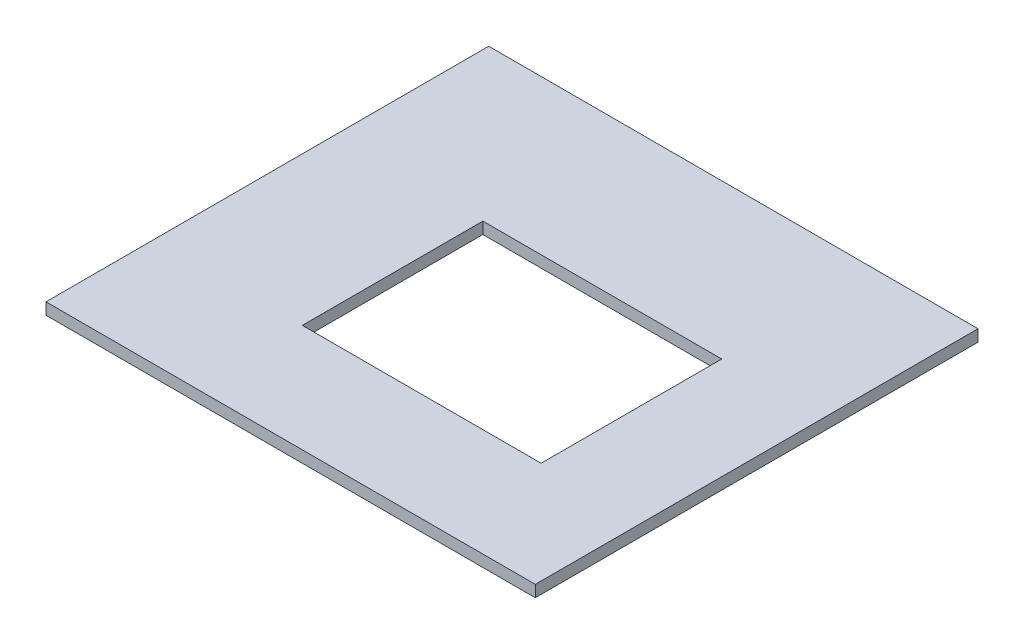
ISO-10303-21;
HEADER;
FILE_DESCRIPTION(('STEP AP214'),'2;1');
FILE_NAME('part.step','',(''),(''),'','','');
FILE_SCHEMA(('AUTOMOTIVE_DESIGN { 1 0 10303 214 1 1 1 1 }'));
ENDSEC;
DATA;
#1=APPLICATION_CONTEXT('core data for automotive mechanical design processes');
#2=APPLICATION_PROTOCOL_DEFINITION('international standard','automotive_design',2000,#1);
#3=PRODUCT_CONTEXT('',#1,'mechanical');
#4=PRODUCT('Part','Part','',(#3));
#5=PRODUCT_RELATED_PRODUCT_CATEGORY('part','',(#4));
#6=PRODUCT_DEFINITION_FORMATION('','',#4);
#7=PRODUCT_DEFINITION_CONTEXT('part definition',#1,'design');
#8=PRODUCT_DEFINITION('design','',#6,#7);
#9=PRODUCT_DEFINITION_SHAPE('','',#8);
#10=(LENGTH_UNIT() NAMED_UNIT(*) SI_UNIT(.MILLI.,.METRE.));
#11=(NAMED_UNIT(*) PLANE_ANGLE_UNIT() SI_UNIT($,.RADIAN.));
#12=(NAMED_UNIT(*) SI_UNIT($,.STERADIAN.) SOLID_ANGLE_UNIT());
#13=UNCERTAINTY_MEASURE_WITH_UNIT(LENGTH_MEASURE(1.E-05),#10,'distance_accuracy_value','');
#14=(GEOMETRIC_REPRESENTATION_CONTEXT(3) GLOBAL_UNCERTAINTY_ASSIGNED_CONTEXT((#13)) GLOBAL_UNIT_ASSIGNED_CONTEXT((#10,
#11,#12)) REPRESENTATION_CONTEXT('',''));
#15=CARTESIAN_POINT('',(0.,0.,0.));
#16=DIRECTION('',(0.,0.,1.));
#17=DIRECTION('',(1.,0.,0.));
#18=AXIS2_PLACEMENT_3D('',#15,#16,#17);
#19=CARTESIAN_POINT('',(21.,1.,-19.));
#20=DIRECTION('',(-1.,0.,0.));
#21=DIRECTION('',(0.,0.,1.));
#22=AXIS2_PLACEMENT_3D('',#19,#20,#21);
#23=PLANE('',#22);
#24=DIRECTION('',(0.,0.,-1.));
#25=VECTOR('',#24,1.);
#26=CARTESIAN_POINT('',(21.,0.,-19.));
#27=LINE('',#26,#25);
#28=CARTESIAN_POINT('',(21.,0.,19.));
#29=VERTEX_POINT('',#28);
#30=CARTESIAN_POINT('',(21.,0.,-19.));
#31=VERTEX_POINT('',#30);
#32=EDGE_CURVE('E119',#29,#31,#27,.T.);
#33=ORIENTED_EDGE('',*,*,#32,.T.);
#34=DIRECTION('',(0.,-1.,0.));
#35=VECTOR('',#34,1.);
#36=CARTESIAN_POINT('',(21.,1.,-19.));
#37=LINE('',#36,#35);
#38=CARTESIAN_POINT('',(21.,1.,-19.));
#39=VERTEX_POINT('',#38);
#40=EDGE_CURVE('E11',#39,#31,#37,.T.);
#41=ORIENTED_EDGE('',*,*,#40,.F.);
#42=DIRECTION('',(0.,0.,-1.));
#43=VECTOR('',#42,1.);
#44=CARTESIAN_POINT('',(21.,1.,-19.));
#45=LINE('',#44,#43);
#46=CARTESIAN_POINT('',(21.,1.,19.));
#47=VERTEX_POINT('',#46);
#48=EDGE_CURVE('E151',#47,#39,#45,.T.);
#49=ORIENTED_EDGE('',*,*,#48,.F.);
#50=DIRECTION('',(0.,-1.,0.));
#51=VECTOR('',#50,1.);
#52=CARTESIAN_POINT('',(21.,1.,19.));
#53=LINE('',#52,#51);
#54=EDGE_CURVE('E165',#47,#29,#53,.T.);
#55=ORIENTED_EDGE('',*,*,#54,.T.);
#56=EDGE_LOOP('',(#33,#41,#49,#55));
#57=FACE_BOUND('',#56,.T.);
#58=ADVANCED_FACE('F38',(#57),#23,.F.);
#59=CARTESIAN_POINT('',(-21.,1.,-19.));
#60=DIRECTION('',(0.,0.,1.));
#61=DIRECTION('',(1.,0.,0.));
#62=AXIS2_PLACEMENT_3D('',#59,#60,#61);
#63=PLANE('',#62);
#64=DIRECTION('',(-1.,0.,0.));
#65=VECTOR('',#64,1.);
#66=CARTESIAN_POINT('',(-21.,0.,-19.));
#67=LINE('',#66,#65);
#68=CARTESIAN_POINT('',(-21.,0.,-19.));
#69=VERTEX_POINT('',#68);
#70=EDGE_CURVE('E169',#31,#69,#67,.T.);
#71=ORIENTED_EDGE('',*,*,#70,.T.);
#72=DIRECTION('',(0.,-1.,0.));
#73=VECTOR('',#72,1.);
#74=CARTESIAN_POINT('',(-21.,1.,-19.));
#75=LINE('',#74,#73);
#76=CARTESIAN_POINT('',(-21.,1.,-19.));
#77=VERTEX_POINT('',#76);
#78=EDGE_CURVE('E46',#77,#69,#75,.T.);
#79=ORIENTED_EDGE('',*,*,#78,.F.);
#80=DIRECTION('',(-1.,0.,0.));
#81=VECTOR('',#80,1.);
#82=CARTESIAN_POINT('',(-21.,1.,-19.));
#83=LINE('',#82,#81);
#84=EDGE_CURVE('E155',#39,#77,#83,.T.);
#85=ORIENTED_EDGE('',*,*,#84,.F.);
#86=ORIENTED_EDGE('',*,*,#40,.T.);
#87=EDGE_LOOP('',(#71,#79,#85,#86));
#88=FACE_BOUND('',#87,.T.);
#89=ADVANCED_FACE('F203',(#88),#63,.F.);
#90=CARTESIAN_POINT('',(-21.,1.,-19.));
#91=DIRECTION('',(1.,0.,0.));
#92=DIRECTION('',(0.,0.,-1.));
#93=AXIS2_PLACEMENT_3D('',#90,#91,#92);
#94=PLANE('',#93);
#95=DIRECTION('',(0.,0.,1.));
#96=VECTOR('',#95,1.);
#97=CARTESIAN_POINT('',(-21.,0.,-19.));
#98=LINE('',#97,#96);
#99=CARTESIAN_POINT('',(-21.,0.,19.));
#100=VERTEX_POINT('',#99);
#101=EDGE_CURVE('E172',#69,#100,#98,.T.);
#102=ORIENTED_EDGE('',*,*,#101,.T.);
#103=DIRECTION('',(0.,-1.,0.));
#104=VECTOR('',#103,1.);
#105=CARTESIAN_POINT('',(-21.,1.,19.));
#106=LINE('',#105,#104);
#107=CARTESIAN_POINT('',(-21.,1.,19.));
#108=VERTEX_POINT('',#107);
#109=EDGE_CURVE('E180',#108,#100,#106,.T.);
#110=ORIENTED_EDGE('',*,*,#109,.F.);
#111=DIRECTION('',(0.,0.,1.));
#112=VECTOR('',#111,1.);
#113=CARTESIAN_POINT('',(-21.,1.,-19.));
#114=LINE('',#113,#112);
#115=EDGE_CURVE('E159',#77,#108,#114,.T.);
#116=ORIENTED_EDGE('',*,*,#115,.F.);
#117=ORIENTED_EDGE('',*,*,#78,.T.);
#118=EDGE_LOOP('',(#102,#110,#116,#117));
#119=FACE_BOUND('',#118,.T.);
#120=ADVANCED_FACE('F189',(#119),#94,.F.);
#121=CARTESIAN_POINT('',(-21.,1.,19.));
#122=DIRECTION('',(0.,0.,-1.));
#123=DIRECTION('',(-1.,0.,0.));
#124=AXIS2_PLACEMENT_3D('',#121,#122,#123);
#125=PLANE('',#124);
#126=DIRECTION('',(1.,0.,0.));
#127=VECTOR('',#126,1.);
#128=CARTESIAN_POINT('',(-21.,0.,19.));
#129=LINE('',#128,#127);
#130=EDGE_CURVE('E156',#100,#29,#129,.T.);
#131=ORIENTED_EDGE('',*,*,#130,.T.);
#132=ORIENTED_EDGE('',*,*,#54,.F.);
#133=DIRECTION('',(1.,0.,0.));
#134=VECTOR('',#133,1.);
#135=CARTESIAN_POINT('',(-21.,1.,19.));
#136=LINE('',#135,#134);
#137=EDGE_CURVE('E162',#108,#47,#136,.T.);
#138=ORIENTED_EDGE('',*,*,#137,.F.);
#139=ORIENTED_EDGE('',*,*,#109,.T.);
#140=EDGE_LOOP('',(#131,#132,#138,#139));
#141=FACE_BOUND('',#140,.T.);
#142=ADVANCED_FACE('F196',(#141),#125,.F.);
#143=CARTESIAN_POINT('',(0.,1.,0.));
#144=DIRECTION('',(0.,1.,0.));
#145=DIRECTION('',(0.,0.,1.));
#146=AXIS2_PLACEMENT_3D('',#143,#144,#145);
#147=PLANE('',#146);
#148=DIRECTION('',(0.,0.,-1.));
#149=VECTOR('',#148,1.);
#150=CARTESIAN_POINT('',(12.25,1.,-5.75));
#151=LINE('',#150,#149);
#152=CARTESIAN_POINT('',(12.25,1.,9.75));
#153=VERTEX_POINT('',#152);
#154=CARTESIAN_POINT('',(12.25,1.,-5.75));
#155=VERTEX_POINT('',#154);
#156=EDGE_CURVE('E53',#153,#155,#151,.T.);
#157=ORIENTED_EDGE('',*,*,#156,.F.);
#158=DIRECTION('',(1.,0.,0.));
#159=VECTOR('',#158,1.);
#160=CARTESIAN_POINT('',(-8.25,1.,9.75));
#161=LINE('',#160,#159);
#162=CARTESIAN_POINT('',(-8.25,1.,9.75));
#163=VERTEX_POINT('',#162);
#164=EDGE_CURVE('E112',#163,#153,#161,.T.);
#165=ORIENTED_EDGE('',*,*,#164,.F.);
#166=DIRECTION('',(0.,0.,1.));
#167=VECTOR('',#166,1.);
#168=CARTESIAN_POINT('',(-8.25,1.,-5.75));
#169=LINE('',#168,#167);
#170=CARTESIAN_POINT('',(-8.25,1.,-5.75));
#171=VERTEX_POINT('',#170);
#172=EDGE_CURVE('E137',#171,#163,#169,.T.);
#173=ORIENTED_EDGE('',*,*,#172,.F.);
#174=DIRECTION('',(-1.,0.,0.));
#175=VECTOR('',#174,1.);
#176=CARTESIAN_POINT('',(-8.25,1.,-5.75));
#177=LINE('',#176,#175);
#178=EDGE_CURVE('E130',#155,#171,#177,.T.);
#179=ORIENTED_EDGE('',*,*,#178,.F.);
#180=EDGE_LOOP('',(#157,#165,#173,#179));
#181=FACE_BOUND('',#180,.T.);
#182=ORIENTED_EDGE('',*,*,#48,.T.);
#183=ORIENTED_EDGE('',*,*,#84,.T.);
#184=ORIENTED_EDGE('',*,*,#115,.T.);
#185=ORIENTED_EDGE('',*,*,#137,.T.);
#186=EDGE_LOOP('',(#182,#183,#184,#185));
#187=FACE_BOUND('',#186,.T.);
#188=ADVANCED_FACE('F202',(#181,#187),#147,.T.);
#189=CARTESIAN_POINT('',(0.,0.,0.));
#190=DIRECTION('',(0.,1.,0.));
#191=DIRECTION('',(0.,0.,1.));
#192=AXIS2_PLACEMENT_3D('',#189,#190,#191);
#193=PLANE('',#192);
#194=DIRECTION('',(-1.,0.,0.));
#195=VECTOR('',#194,1.);
#196=CARTESIAN_POINT('',(-8.25,0.,9.75));
#197=LINE('',#196,#195);
#198=CARTESIAN_POINT('',(12.25,0.,9.75));
#199=VERTEX_POINT('',#198);
#200=CARTESIAN_POINT('',(-8.25,0.,9.75));
#201=VERTEX_POINT('',#200);
#202=EDGE_CURVE('E125',#199,#201,#197,.T.);
#203=ORIENTED_EDGE('',*,*,#202,.F.);
#204=DIRECTION('',(0.,0.,1.));
#205=VECTOR('',#204,1.);
#206=CARTESIAN_POINT('',(12.25,0.,-5.75));
#207=LINE('',#206,#205);
#208=CARTESIAN_POINT('',(12.25,0.,-5.75));
#209=VERTEX_POINT('',#208);
#210=EDGE_CURVE('E105',#209,#199,#207,.T.);
#211=ORIENTED_EDGE('',*,*,#210,.F.);
#212=DIRECTION('',(1.,0.,0.));
#213=VECTOR('',#212,1.);
#214=CARTESIAN_POINT('',(-8.25,0.,-5.75));
#215=LINE('',#214,#213);
#216=CARTESIAN_POINT('',(-8.25,0.,-5.75));
#217=VERTEX_POINT('',#216);
#218=EDGE_CURVE('E115',#217,#209,#215,.T.);
#219=ORIENTED_EDGE('',*,*,#218,.F.);
#220=DIRECTION('',(0.,0.,-1.));
#221=VECTOR('',#220,1.);
#222=CARTESIAN_POINT('',(-8.25,0.,-5.75));
#223=LINE('',#222,#221);
#224=EDGE_CURVE('E61',#201,#217,#223,.T.);
#225=ORIENTED_EDGE('',*,*,#224,.F.);
#226=EDGE_LOOP('',(#203,#211,#219,#225));
#227=FACE_BOUND('',#226,.T.);
#228=ORIENTED_EDGE('',*,*,#32,.F.);
#229=ORIENTED_EDGE('',*,*,#130,.F.);
#230=ORIENTED_EDGE('',*,*,#101,.F.);
#231=ORIENTED_EDGE('',*,*,#70,.F.);
#232=EDGE_LOOP('',(#228,#229,#230,#231));
#233=FACE_BOUND('',#232,.T.);
#234=ADVANCED_FACE('F122',(#227,#233),#193,.F.);
#235=CARTESIAN_POINT('',(12.25,-0.000999999999999916,-5.75));
#236=DIRECTION('',(1.,0.,0.));
#237=DIRECTION('',(0.,0.,-1.));
#238=AXIS2_PLACEMENT_3D('',#235,#236,#237);
#239=PLANE('',#238);
#240=ORIENTED_EDGE('',*,*,#210,.T.);
#241=DIRECTION('',(0.,1.,0.));
#242=VECTOR('',#241,1.);
#243=CARTESIAN_POINT('',(12.25,-0.000999999999999916,9.75));
#244=LINE('',#243,#242);
#245=EDGE_CURVE('E120',#199,#153,#244,.T.);
#246=ORIENTED_EDGE('',*,*,#245,.T.);
#247=ORIENTED_EDGE('',*,*,#156,.T.);
#248=DIRECTION('',(0.,1.,0.));
#249=VECTOR('',#248,1.);
#250=CARTESIAN_POINT('',(12.25,-0.000999999999999916,-5.75));
#251=LINE('',#250,#249);
#252=EDGE_CURVE('E101',#209,#155,#251,.T.);
#253=ORIENTED_EDGE('',*,*,#252,.F.);
#254=EDGE_LOOP('',(#240,#246,#247,#253));
#255=FACE_BOUND('',#254,.T.);
#256=ADVANCED_FACE('F103',(#255),#239,.F.);
#257=CARTESIAN_POINT('',(-8.25,-0.000999999999999916,9.75));
#258=DIRECTION('',(0.,0.,1.));
#259=DIRECTION('',(1.,0.,0.));
#260=AXIS2_PLACEMENT_3D('',#257,#258,#259);
#261=PLANE('',#260);
#262=ORIENTED_EDGE('',*,*,#202,.T.);
#263=DIRECTION('',(0.,1.,0.));
#264=VECTOR('',#263,1.);
#265=CARTESIAN_POINT('',(-8.25,-0.000999999999999916,9.75));
#266=LINE('',#265,#264);
#267=EDGE_CURVE('E146',#201,#163,#266,.T.);
#268=ORIENTED_EDGE('',*,*,#267,.T.);
#269=ORIENTED_EDGE('',*,*,#164,.T.);
#270=ORIENTED_EDGE('',*,*,#245,.F.);
#271=EDGE_LOOP('',(#262,#268,#269,#270));
#272=FACE_BOUND('',#271,.T.);
#273=ADVANCED_FACE('F220',(#272),#261,.F.);
#274=CARTESIAN_POINT('',(-8.25,-0.000999999999999916,-5.75));
#275=DIRECTION('',(-1.,0.,0.));
#276=DIRECTION('',(0.,0.,1.));
#277=AXIS2_PLACEMENT_3D('',#274,#275,#276);
#278=PLANE('',#277);
#279=ORIENTED_EDGE('',*,*,#224,.T.);
#280=DIRECTION('',(0.,1.,0.));
#281=VECTOR('',#280,1.);
#282=CARTESIAN_POINT('',(-8.25,-0.000999999999999916,-5.75));
#283=LINE('',#282,#281);
#284=EDGE_CURVE('E111',#217,#171,#283,.T.);
#285=ORIENTED_EDGE('',*,*,#284,.T.);
#286=ORIENTED_EDGE('',*,*,#172,.T.);
#287=ORIENTED_EDGE('',*,*,#267,.F.);
#288=EDGE_LOOP('',(#279,#285,#286,#287));
#289=FACE_BOUND('',#288,.T.);
#290=ADVANCED_FACE('F223',(#289),#278,.F.);
#291=CARTESIAN_POINT('',(-8.25,-0.000999999999999916,-5.75));
#292=DIRECTION('',(0.,0.,-1.));
#293=DIRECTION('',(-1.,0.,0.));
#294=AXIS2_PLACEMENT_3D('',#291,#292,#293);
#295=PLANE('',#294);
#296=ORIENTED_EDGE('',*,*,#218,.T.);
#297=ORIENTED_EDGE('',*,*,#252,.T.);
#298=ORIENTED_EDGE('',*,*,#178,.T.);
#299=ORIENTED_EDGE('',*,*,#284,.F.);
#300=EDGE_LOOP('',(#296,#297,#298,#299));
#301=FACE_BOUND('',#300,.T.);
#302=ADVANCED_FACE('F116',(#301),#295,.F.);
#303=CLOSED_SHELL('',(#58,#89,#120,#142,#188,#234,#256,#273,#290,#302));
#304=MANIFOLD_SOLID_BREP('B2',#303);
#305=ADVANCED_BREP_SHAPE_REPRESENTATION('',(#18,#304),#14);
#306=SHAPE_DEFINITION_REPRESENTATION(#9,#305);
ENDSEC;
END-ISO-10303-21;
